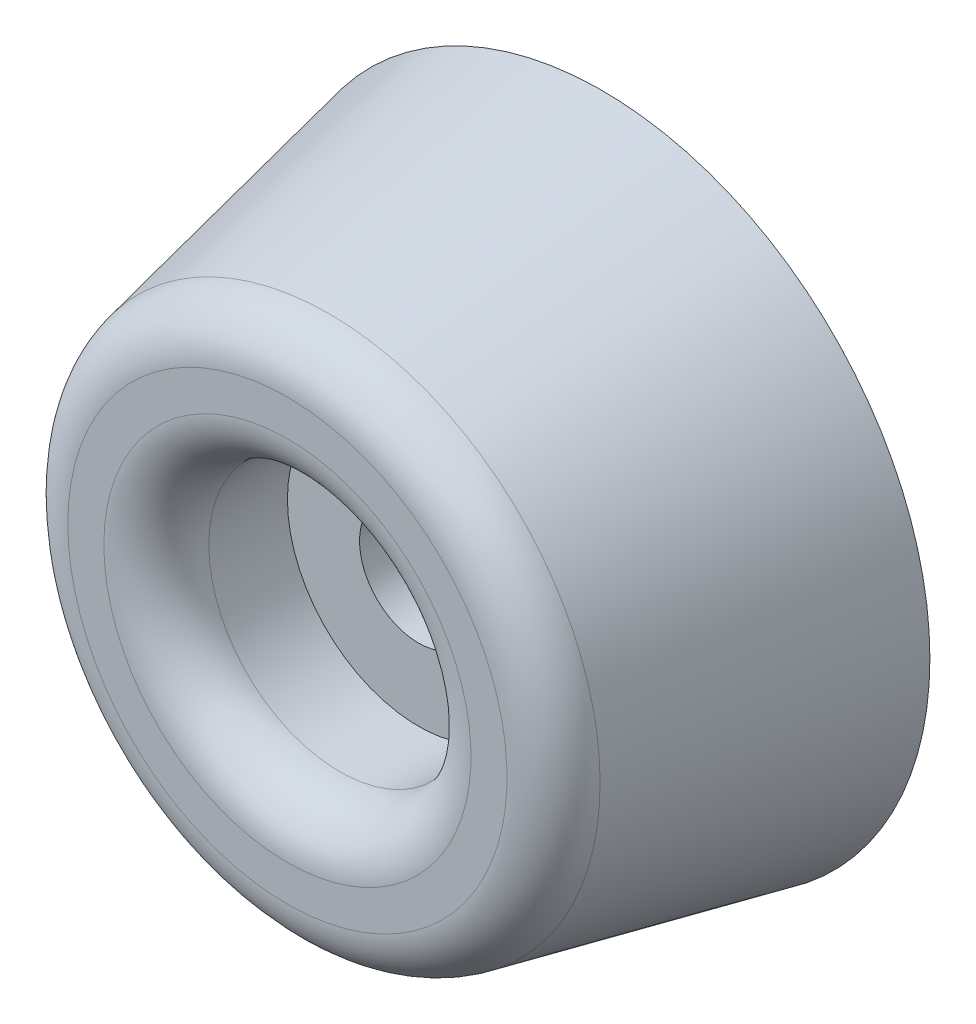
ISO-10303-21;
HEADER;
FILE_DESCRIPTION(('STEP AP214'),'2;1');
FILE_NAME('part.step','',(''),(''),'','','');
FILE_SCHEMA(('AUTOMOTIVE_DESIGN { 1 0 10303 214 1 1 1 1 }'));
ENDSEC;
DATA;
#1=APPLICATION_CONTEXT('core data for automotive mechanical design processes');
#2=APPLICATION_PROTOCOL_DEFINITION('international standard','automotive_design',2000,#1);
#3=PRODUCT_CONTEXT('',#1,'mechanical');
#4=PRODUCT('Part','Part','',(#3));
#5=PRODUCT_RELATED_PRODUCT_CATEGORY('part','',(#4));
#6=PRODUCT_DEFINITION_FORMATION('','',#4);
#7=PRODUCT_DEFINITION_CONTEXT('part definition',#1,'design');
#8=PRODUCT_DEFINITION('design','',#6,#7);
#9=PRODUCT_DEFINITION_SHAPE('','',#8);
#10=(LENGTH_UNIT() NAMED_UNIT(*) SI_UNIT(.MILLI.,.METRE.));
#11=(NAMED_UNIT(*) PLANE_ANGLE_UNIT() SI_UNIT($,.RADIAN.));
#12=(NAMED_UNIT(*) SI_UNIT($,.STERADIAN.) SOLID_ANGLE_UNIT());
#13=UNCERTAINTY_MEASURE_WITH_UNIT(LENGTH_MEASURE(1.E-05),#10,'distance_accuracy_value','');
#14=(GEOMETRIC_REPRESENTATION_CONTEXT(3) GLOBAL_UNCERTAINTY_ASSIGNED_CONTEXT((#13)) GLOBAL_UNIT_ASSIGNED_CONTEXT((#10,
#11,#12)) REPRESENTATION_CONTEXT('',''));
#15=CARTESIAN_POINT('',(0.,0.,0.));
#16=DIRECTION('',(0.,0.,1.));
#17=DIRECTION('',(1.,0.,0.));
#18=AXIS2_PLACEMENT_3D('',#15,#16,#17);
#19=CARTESIAN_POINT('',(0.,0.,-12.001));
#20=DIRECTION('',(0.,0.,1.));
#21=DIRECTION('',(1.,0.,0.));
#22=AXIS2_PLACEMENT_3D('',#19,#20,#21);
#23=CYLINDRICAL_SURFACE('',#22,2.25);
#24=CARTESIAN_POINT('',(0.,0.,-12.));
#25=DIRECTION('',(0.,0.,1.));
#26=DIRECTION('',(1.,0.,0.));
#27=AXIS2_PLACEMENT_3D('',#24,#25,#26);
#28=CIRCLE('',#27,2.25);
#29=CARTESIAN_POINT('',(2.25,0.,-12.));
#30=VERTEX_POINT('',#29);
#31=EDGE_CURVE('E55',#30,#30,#28,.F.);
#32=ORIENTED_EDGE('',*,*,#31,.T.);
#33=EDGE_LOOP('',(#32));
#34=FACE_BOUND('',#33,.T.);
#35=CARTESIAN_POINT('',(0.,0.,-5.));
#36=DIRECTION('',(0.,0.,1.));
#37=DIRECTION('',(1.,0.,0.));
#38=AXIS2_PLACEMENT_3D('',#35,#36,#37);
#39=CIRCLE('',#38,2.25);
#40=CARTESIAN_POINT('',(2.25,0.,-5.));
#41=VERTEX_POINT('',#40);
#42=EDGE_CURVE('E52',#41,#41,#39,.F.);
#43=ORIENTED_EDGE('',*,*,#42,.F.);
#44=EDGE_LOOP('',(#43));
#45=FACE_BOUND('',#44,.T.);
#46=ADVANCED_FACE('F31',(#34,#45),#23,.F.);
#47=CARTESIAN_POINT('',(0.,10.,0.));
#48=DIRECTION('',(0.,0.,-1.));
#49=DIRECTION('',(-1.,0.,0.));
#50=AXIS2_PLACEMENT_3D('',#47,#48,#49);
#51=PLANE('',#50);
#52=CARTESIAN_POINT('',(0.,0.,0.));
#53=DIRECTION('',(0.,0.,-1.));
#54=DIRECTION('',(-1.,0.,0.));
#55=AXIS2_PLACEMENT_3D('',#52,#53,#54);
#56=CIRCLE('',#55,7.);
#57=CARTESIAN_POINT('',(-7.,0.,0.));
#58=VERTEX_POINT('',#57);
#59=EDGE_CURVE('E38',#58,#58,#56,.T.);
#60=ORIENTED_EDGE('',*,*,#59,.T.);
#61=EDGE_LOOP('',(#60));
#62=FACE_BOUND('',#61,.T.);
#63=CARTESIAN_POINT('',(0.,0.,0.));
#64=DIRECTION('',(0.,0.,-1.));
#65=DIRECTION('',(-1.,0.,0.));
#66=AXIS2_PLACEMENT_3D('',#63,#64,#65);
#67=CIRCLE('',#66,8.37372488797812);
#68=CARTESIAN_POINT('',(-8.37372488797812,0.,0.));
#69=VERTEX_POINT('',#68);
#70=EDGE_CURVE('E42',#69,#69,#67,.F.);
#71=ORIENTED_EDGE('',*,*,#70,.T.);
#72=EDGE_LOOP('',(#71));
#73=FACE_BOUND('',#72,.T.);
#74=ADVANCED_FACE('F81',(#62,#73),#51,.F.);
#75=CARTESIAN_POINT('',(0.,0.,-12.));
#76=DIRECTION('',(0.,0.,1.));
#77=DIRECTION('',(1.,0.,0.));
#78=AXIS2_PLACEMENT_3D('',#75,#76,#77);
#79=PLANE('',#78);
#80=ORIENTED_EDGE('',*,*,#31,.F.);
#81=EDGE_LOOP('',(#80));
#82=FACE_BOUND('',#81,.T.);
#83=CARTESIAN_POINT('',(0.,0.,-12.));
#84=DIRECTION('',(0.,0.,1.));
#85=DIRECTION('',(1.,0.,0.));
#86=AXIS2_PLACEMENT_3D('',#83,#84,#85);
#87=CIRCLE('',#86,12.5);
#88=CARTESIAN_POINT('',(12.5,0.,-12.));
#89=VERTEX_POINT('',#88);
#90=EDGE_CURVE('E51',#89,#89,#87,.T.);
#91=ORIENTED_EDGE('',*,*,#90,.F.);
#92=EDGE_LOOP('',(#91));
#93=FACE_BOUND('',#92,.T.);
#94=ADVANCED_FACE('F86',(#82,#93),#79,.F.);
#95=CARTESIAN_POINT('',(0.,0.,-12.));
#96=DIRECTION('',(0.,0.,-1.));
#97=DIRECTION('',(-1.,0.,0.));
#98=AXIS2_PLACEMENT_3D('',#95,#96,#97);
#99=CONICAL_SURFACE('',#98,12.5,0.205395389189767);
#100=CARTESIAN_POINT('',(0.,0.,-1.59209149177599));
#101=DIRECTION('',(0.,0.,1.));
#102=DIRECTION('',(1.,0.,0.));
#103=AXIS2_PLACEMENT_3D('',#100,#101,#102);
#104=CIRCLE('',#103,10.3316857274533);
#105=CARTESIAN_POINT('',(10.3316857274533,0.,-1.59209149177599));
#106=VERTEX_POINT('',#105);
#107=EDGE_CURVE('E10',#106,#106,#104,.F.);
#108=ORIENTED_EDGE('',*,*,#107,.T.);
#109=EDGE_LOOP('',(#108));
#110=FACE_BOUND('',#109,.T.);
#111=ORIENTED_EDGE('',*,*,#90,.T.);
#112=EDGE_LOOP('',(#111));
#113=FACE_BOUND('',#112,.T.);
#114=ADVANCED_FACE('F77',(#110,#113),#99,.T.);
#115=CARTESIAN_POINT('',(0.,0.,-5.));
#116=DIRECTION('',(0.,0.,1.));
#117=DIRECTION('',(1.,0.,0.));
#118=AXIS2_PLACEMENT_3D('',#115,#116,#117);
#119=PLANE('',#118);
#120=CARTESIAN_POINT('',(0.,0.,-5.));
#121=DIRECTION('',(0.,0.,1.));
#122=DIRECTION('',(1.,0.,0.));
#123=AXIS2_PLACEMENT_3D('',#120,#121,#122);
#124=CIRCLE('',#123,5.);
#125=CARTESIAN_POINT('',(5.,0.,-5.));
#126=VERTEX_POINT('',#125);
#127=EDGE_CURVE('E56',#126,#126,#124,.T.);
#128=ORIENTED_EDGE('',*,*,#127,.T.);
#129=EDGE_LOOP('',(#128));
#130=FACE_BOUND('',#129,.T.);
#131=ORIENTED_EDGE('',*,*,#42,.T.);
#132=EDGE_LOOP('',(#131));
#133=FACE_BOUND('',#132,.T.);
#134=ADVANCED_FACE('F64',(#130,#133),#119,.T.);
#135=CARTESIAN_POINT('',(0.,0.,-5.));
#136=DIRECTION('',(0.,0.,1.));
#137=DIRECTION('',(1.,0.,0.));
#138=AXIS2_PLACEMENT_3D('',#135,#136,#137);
#139=CYLINDRICAL_SURFACE('',#138,5.);
#140=CARTESIAN_POINT('',(0.,0.,-2.));
#141=DIRECTION('',(0.,0.,-1.));
#142=DIRECTION('',(-1.,0.,0.));
#143=AXIS2_PLACEMENT_3D('',#140,#141,#142);
#144=CIRCLE('',#143,5.);
#145=CARTESIAN_POINT('',(-5.,0.,-2.));
#146=VERTEX_POINT('',#145);
#147=EDGE_CURVE('E46',#146,#146,#144,.F.);
#148=ORIENTED_EDGE('',*,*,#147,.T.);
#149=EDGE_LOOP('',(#148));
#150=FACE_BOUND('',#149,.T.);
#151=ORIENTED_EDGE('',*,*,#127,.F.);
#152=EDGE_LOOP('',(#151));
#153=FACE_BOUND('',#152,.T.);
#154=ADVANCED_FACE('F67',(#150,#153),#139,.F.);
#155=CARTESIAN_POINT('',(0.,0.,-2.));
#156=DIRECTION('',(0.,0.,-1.));
#157=DIRECTION('',(-1.,0.,0.));
#158=AXIS2_PLACEMENT_3D('',#155,#156,#157);
#159=TOROIDAL_SURFACE('',#158,7.,2.);
#160=ORIENTED_EDGE('',*,*,#59,.F.);
#161=EDGE_LOOP('',(#160));
#162=FACE_BOUND('',#161,.T.);
#163=ORIENTED_EDGE('',*,*,#147,.F.);
#164=EDGE_LOOP('',(#163));
#165=FACE_BOUND('',#164,.T.);
#166=ADVANCED_FACE('F69',(#162,#165),#159,.T.);
#167=CARTESIAN_POINT('',(0.,0.,-2.));
#168=DIRECTION('',(0.,0.,-1.));
#169=DIRECTION('',(-1.,0.,0.));
#170=AXIS2_PLACEMENT_3D('',#167,#168,#169);
#171=TOROIDAL_SURFACE('',#170,8.37372488797812,2.);
#172=ORIENTED_EDGE('',*,*,#107,.F.);
#173=EDGE_LOOP('',(#172));
#174=FACE_BOUND('',#173,.T.);
#175=ORIENTED_EDGE('',*,*,#70,.F.);
#176=EDGE_LOOP('',(#175));
#177=FACE_BOUND('',#176,.T.);
#178=ADVANCED_FACE('F33',(#174,#177),#171,.T.);
#179=CLOSED_SHELL('',(#46,#74,#94,#114,#134,#154,#166,#178));
#180=MANIFOLD_SOLID_BREP('B2',#179);
#181=ADVANCED_BREP_SHAPE_REPRESENTATION('',(#18,#180),#14);
#182=SHAPE_DEFINITION_REPRESENTATION(#9,#181);
ENDSEC;
END-ISO-10303-21;
